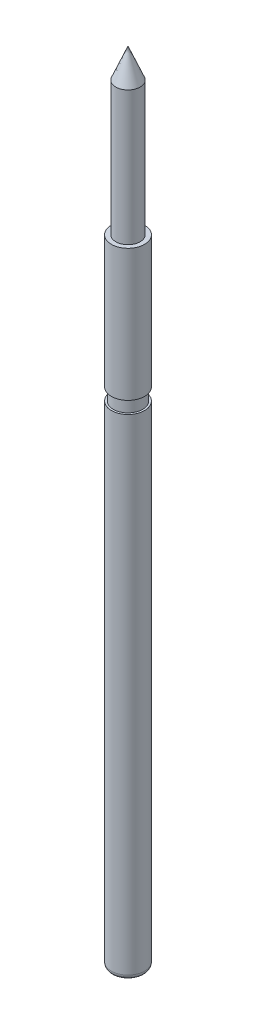
ISO-10303-21;
HEADER;
FILE_DESCRIPTION(('STEP AP214'),'2;1');
FILE_NAME('part.step','',(''),(''),'','','');
FILE_SCHEMA(('AUTOMOTIVE_DESIGN { 1 0 10303 214 1 1 1 1 }'));
ENDSEC;
DATA;
#1=APPLICATION_CONTEXT('core data for automotive mechanical design processes');
#2=APPLICATION_PROTOCOL_DEFINITION('international standard','automotive_design',2000,#1);
#3=PRODUCT_CONTEXT('',#1,'mechanical');
#4=PRODUCT('Part','Part','',(#3));
#5=PRODUCT_RELATED_PRODUCT_CATEGORY('part','',(#4));
#6=PRODUCT_DEFINITION_FORMATION('','',#4);
#7=PRODUCT_DEFINITION_CONTEXT('part definition',#1,'design');
#8=PRODUCT_DEFINITION('design','',#6,#7);
#9=PRODUCT_DEFINITION_SHAPE('','',#8);
#10=(LENGTH_UNIT() NAMED_UNIT(*) SI_UNIT(.MILLI.,.METRE.));
#11=(NAMED_UNIT(*) PLANE_ANGLE_UNIT() SI_UNIT($,.RADIAN.));
#12=(NAMED_UNIT(*) SI_UNIT($,.STERADIAN.) SOLID_ANGLE_UNIT());
#13=UNCERTAINTY_MEASURE_WITH_UNIT(LENGTH_MEASURE(1.E-05),#10,'distance_accuracy_value','');
#14=(GEOMETRIC_REPRESENTATION_CONTEXT(3) GLOBAL_UNCERTAINTY_ASSIGNED_CONTEXT((#13)) GLOBAL_UNIT_ASSIGNED_CONTEXT((#10,
#11,#12)) REPRESENTATION_CONTEXT('',''));
#15=CARTESIAN_POINT('',(0.,0.,0.));
#16=DIRECTION('',(0.,0.,1.));
#17=DIRECTION('',(1.,0.,0.));
#18=AXIS2_PLACEMENT_3D('',#15,#16,#17);
#19=CARTESIAN_POINT('',(0.,15.7464466094049,0.));
#20=DIRECTION('',(0.,-1.,0.));
#21=DIRECTION('',(0.,0.,-1.));
#22=AXIS2_PLACEMENT_3D('',#19,#20,#21);
#23=CONICAL_SURFACE('',#22,0.24999999999997,0.392699081697587);
#24=CARTESIAN_POINT('',(0.,15.7464466094018,0.));
#25=DIRECTION('',(0.,1.,0.));
#26=DIRECTION('',(0.,0.,-1.));
#27=AXIS2_PLACEMENT_3D('',#24,#25,#26);
#28=CIRCLE('',#27,0.250000000000012);
#29=CARTESIAN_POINT('',(0.,15.7464466094018,-0.25));
#30=VERTEX_POINT('',#29);
#31=EDGE_CURVE('E95',#30,#30,#28,.T.);
#32=ORIENTED_EDGE('',*,*,#31,.T.);
#33=EDGE_LOOP('',(#32));
#34=FACE_BOUND('',#33,.T.);
#35=CARTESIAN_POINT('',(0.,16.35,0.));
#36=VERTEX_POINT('',#35);
#37=VERTEX_LOOP('',#36);
#38=FACE_BOUND('',#37,.T.);
#39=ADVANCED_FACE('F24',(#34,#38),#23,.T.);
#40=CARTESIAN_POINT('',(0.,12.9999999999981,0.));
#41=DIRECTION('',(0.,1.,0.));
#42=DIRECTION('',(-1.,0.,0.));
#43=AXIS2_PLACEMENT_3D('',#40,#41,#42);
#44=CYLINDRICAL_SURFACE('',#43,0.250000000000012);
#45=CARTESIAN_POINT('',(0.,12.9999999999981,0.));
#46=DIRECTION('',(0.,1.,0.));
#47=DIRECTION('',(-1.,0.,0.));
#48=AXIS2_PLACEMENT_3D('',#45,#46,#47);
#49=CIRCLE('',#48,0.250000000000012);
#50=CARTESIAN_POINT('',(-0.250000000000012,12.9999999999981,0.));
#51=VERTEX_POINT('',#50);
#52=EDGE_CURVE('E96',#51,#51,#49,.F.);
#53=ORIENTED_EDGE('',*,*,#52,.F.);
#54=EDGE_LOOP('',(#53));
#55=FACE_BOUND('',#54,.T.);
#56=ORIENTED_EDGE('',*,*,#31,.F.);
#57=EDGE_LOOP('',(#56));
#58=FACE_BOUND('',#57,.T.);
#59=ADVANCED_FACE('F49',(#55,#58),#44,.T.);
#60=CARTESIAN_POINT('',(0.3596539083136,13.,0.3596539083136));
#61=DIRECTION('',(0.,1.,0.));
#62=DIRECTION('',(0.,0.,-1.));
#63=AXIS2_PLACEMENT_3D('',#60,#61,#62);
#64=PLANE('',#63);
#65=ORIENTED_EDGE('',*,*,#52,.T.);
#66=EDGE_LOOP('',(#65));
#67=FACE_BOUND('',#66,.T.);
#68=CARTESIAN_POINT('',(0.,12.9999999999996,0.));
#69=DIRECTION('',(0.,1.,0.));
#70=DIRECTION('',(0.,0.,1.));
#71=AXIS2_PLACEMENT_3D('',#68,#69,#70);
#72=CIRCLE('',#71,0.34);
#73=CARTESIAN_POINT('',(0.,12.9999999999996,0.340000000000005));
#74=VERTEX_POINT('',#73);
#75=EDGE_CURVE('E125',#74,#74,#72,.T.);
#76=ORIENTED_EDGE('',*,*,#75,.T.);
#77=EDGE_LOOP('',(#76));
#78=FACE_BOUND('',#77,.T.);
#79=ADVANCED_FACE('F56',(#67,#78),#64,.T.);
#80=CARTESIAN_POINT('',(0.,10.3000000000004,0.));
#81=DIRECTION('',(0.,1.,0.));
#82=DIRECTION('',(0.,0.,1.));
#83=AXIS2_PLACEMENT_3D('',#80,#81,#82);
#84=CYLINDRICAL_SURFACE('',#83,0.34);
#85=ORIENTED_EDGE('',*,*,#75,.F.);
#86=EDGE_LOOP('',(#85));
#87=FACE_BOUND('',#86,.T.);
#88=CARTESIAN_POINT('',(0.,10.3000000000004,0.));
#89=DIRECTION('',(0.,1.,0.));
#90=DIRECTION('',(0.,0.,1.));
#91=AXIS2_PLACEMENT_3D('',#88,#89,#90);
#92=CIRCLE('',#91,0.34);
#93=CARTESIAN_POINT('',(0.,10.3000000000004,0.340000000000012));
#94=VERTEX_POINT('',#93);
#95=EDGE_CURVE('E122',#94,#94,#92,.T.);
#96=ORIENTED_EDGE('',*,*,#95,.T.);
#97=EDGE_LOOP('',(#96));
#98=FACE_BOUND('',#97,.T.);
#99=ADVANCED_FACE('F135',(#87,#98),#84,.T.);
#100=CARTESIAN_POINT('',(0.3596539083136,10.3,0.3596539083136));
#101=DIRECTION('',(0.,1.,0.));
#102=DIRECTION('',(0.,0.,-1.));
#103=AXIS2_PLACEMENT_3D('',#100,#101,#102);
#104=PLANE('',#103);
#105=CARTESIAN_POINT('',(0.,10.2999999999969,0.));
#106=DIRECTION('',(0.,1.,0.));
#107=DIRECTION('',(0.,0.,1.));
#108=AXIS2_PLACEMENT_3D('',#105,#106,#107);
#109=CIRCLE('',#108,0.3);
#110=CARTESIAN_POINT('',(0.,10.2999999999969,0.3));
#111=VERTEX_POINT('',#110);
#112=EDGE_CURVE('E119',#111,#111,#109,.T.);
#113=ORIENTED_EDGE('',*,*,#112,.T.);
#114=EDGE_LOOP('',(#113));
#115=FACE_BOUND('',#114,.T.);
#116=ORIENTED_EDGE('',*,*,#95,.F.);
#117=EDGE_LOOP('',(#116));
#118=FACE_BOUND('',#117,.T.);
#119=ADVANCED_FACE('F140',(#115,#118),#104,.F.);
#120=CARTESIAN_POINT('',(0.,10.0500000000031,0.));
#121=DIRECTION('',(0.,1.,0.));
#122=DIRECTION('',(0.,0.,1.));
#123=AXIS2_PLACEMENT_3D('',#120,#121,#122);
#124=CYLINDRICAL_SURFACE('',#123,0.3);
#125=CARTESIAN_POINT('',(0.,10.0500000000031,0.));
#126=DIRECTION('',(0.,1.,0.));
#127=DIRECTION('',(0.,0.,1.));
#128=AXIS2_PLACEMENT_3D('',#125,#126,#127);
#129=CIRCLE('',#128,0.3);
#130=CARTESIAN_POINT('',(0.,10.0500000000031,0.3));
#131=VERTEX_POINT('',#130);
#132=EDGE_CURVE('E116',#131,#131,#129,.F.);
#133=ORIENTED_EDGE('',*,*,#132,.F.);
#134=EDGE_LOOP('',(#133));
#135=FACE_BOUND('',#134,.T.);
#136=ORIENTED_EDGE('',*,*,#112,.F.);
#137=EDGE_LOOP('',(#136));
#138=FACE_BOUND('',#137,.T.);
#139=ADVANCED_FACE('F145',(#135,#138),#124,.T.);
#140=CARTESIAN_POINT('',(0.3596539083136,10.05,0.3596539083136));
#141=DIRECTION('',(0.,1.,0.));
#142=DIRECTION('',(0.,0.,-1.));
#143=AXIS2_PLACEMENT_3D('',#140,#141,#142);
#144=PLANE('',#143);
#145=ORIENTED_EDGE('',*,*,#132,.T.);
#146=EDGE_LOOP('',(#145));
#147=FACE_BOUND('',#146,.T.);
#148=CARTESIAN_POINT('',(0.,10.0500000000002,0.));
#149=DIRECTION('',(0.,1.,0.));
#150=DIRECTION('',(0.,0.,1.));
#151=AXIS2_PLACEMENT_3D('',#148,#149,#150);
#152=CIRCLE('',#151,0.34);
#153=CARTESIAN_POINT('',(0.,10.0500000000002,0.340000000000012));
#154=VERTEX_POINT('',#153);
#155=EDGE_CURVE('E94',#154,#154,#152,.T.);
#156=ORIENTED_EDGE('',*,*,#155,.T.);
#157=EDGE_LOOP('',(#156));
#158=FACE_BOUND('',#157,.T.);
#159=ADVANCED_FACE('F71',(#147,#158),#144,.T.);
#160=CARTESIAN_POINT('',(0.,0.10000000000001,0.));
#161=DIRECTION('',(0.,1.,0.));
#162=DIRECTION('',(0.,0.,1.));
#163=AXIS2_PLACEMENT_3D('',#160,#161,#162);
#164=CYLINDRICAL_SURFACE('',#163,0.34);
#165=ORIENTED_EDGE('',*,*,#155,.F.);
#166=EDGE_LOOP('',(#165));
#167=FACE_BOUND('',#166,.T.);
#168=CARTESIAN_POINT('',(0.,0.0999999999999722,0.));
#169=DIRECTION('',(0.,1.,0.));
#170=DIRECTION('',(-0.994469549599169,0.,0.105025306093463));
#171=AXIS2_PLACEMENT_3D('',#168,#169,#170);
#172=CIRCLE('',#171,0.339999999999999);
#173=CARTESIAN_POINT('',(-0.338119646863717,0.0999999999999722,0.0357086040717894));
#174=VERTEX_POINT('',#173);
#175=EDGE_CURVE('E86',#174,#174,#172,.T.);
#176=ORIENTED_EDGE('',*,*,#175,.T.);
#177=EDGE_LOOP('',(#176));
#178=FACE_BOUND('',#177,.T.);
#179=ADVANCED_FACE('F66',(#167,#178),#164,.T.);
#180=CARTESIAN_POINT('',(0.,0.1,0.));
#181=DIRECTION('',(0.,1.,0.));
#182=DIRECTION('',(-0.994469549599171,0.,0.105025306093449));
#183=AXIS2_PLACEMENT_3D('',#180,#181,#182);
#184=TOROIDAL_SURFACE('',#183,0.239999999999999,0.1);
#185=ORIENTED_EDGE('',*,*,#175,.F.);
#186=EDGE_LOOP('',(#185));
#187=FACE_BOUND('',#186,.T.);
#188=CARTESIAN_POINT('',(0.,0.,0.));
#189=DIRECTION('',(0.,1.,0.));
#190=DIRECTION('',(-1.,0.,-1.30824238703432E-13));
#191=AXIS2_PLACEMENT_3D('',#188,#189,#190);
#192=CIRCLE('',#191,0.23999999999999);
#193=CARTESIAN_POINT('',(-0.239999999999994,0.,5.88040139714065E-10));
#194=VERTEX_POINT('',#193);
#195=CARTESIAN_POINT('',(0.239999999999994,0.,-2.93991344907247E-10));
#196=VERTEX_POINT('',#195);
#197=EDGE_CURVE('E37',#194,#196,#192,.T.);
#198=ORIENTED_EDGE('',*,*,#197,.T.);
#199=CARTESIAN_POINT('',(0.,0.,0.));
#200=DIRECTION('',(0.,1.,0.));
#201=DIRECTION('',(1.,0.,1.49346025816727E-13));
#202=AXIS2_PLACEMENT_3D('',#199,#200,#201);
#203=CIRCLE('',#202,0.23999999999999);
#204=EDGE_CURVE('E13',#196,#194,#203,.T.);
#205=ORIENTED_EDGE('',*,*,#204,.T.);
#206=EDGE_LOOP('',(#198,#205));
#207=FACE_BOUND('',#206,.T.);
#208=ADVANCED_FACE('F62',(#187,#207),#184,.T.);
#209=CARTESIAN_POINT('',(-0.2596539083136,0.,0.2603405591154));
#210=DIRECTION('',(0.,1.,0.));
#211=DIRECTION('',(1.,0.,0.));
#212=AXIS2_PLACEMENT_3D('',#209,#210,#211);
#213=PLANE('',#212);
#214=ORIENTED_EDGE('',*,*,#197,.F.);
#215=ORIENTED_EDGE('',*,*,#204,.F.);
#216=EDGE_LOOP('',(#214,#215));
#217=FACE_BOUND('',#216,.T.);
#218=ADVANCED_FACE('F26',(#217),#213,.F.);
#219=CLOSED_SHELL('',(#39,#59,#79,#99,#119,#139,#159,#179,#208,#218));
#220=MANIFOLD_SOLID_BREP('B1',#219);
#221=ADVANCED_BREP_SHAPE_REPRESENTATION('',(#18,#220),#14);
#222=SHAPE_DEFINITION_REPRESENTATION(#9,#221);
ENDSEC;
END-ISO-10303-21;
